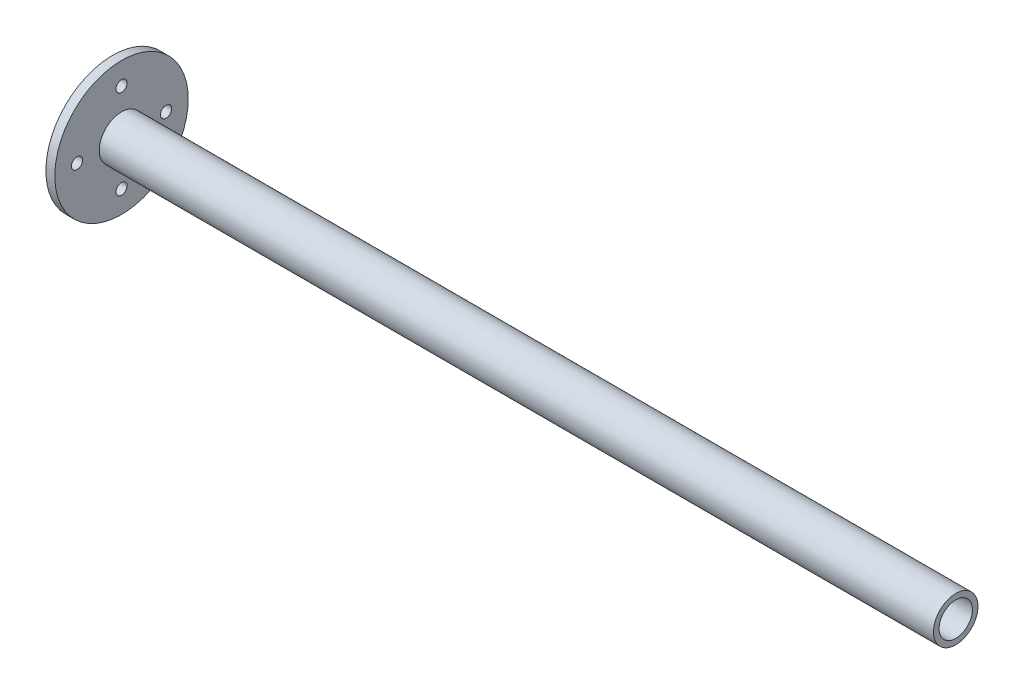
ISO-10303-21;
HEADER;
FILE_DESCRIPTION(('STEP AP214'),'2;1');
FILE_NAME('part.step','',(''),(''),'','','');
FILE_SCHEMA(('AUTOMOTIVE_DESIGN { 1 0 10303 214 1 1 1 1 }'));
ENDSEC;
DATA;
#1=APPLICATION_CONTEXT('core data for automotive mechanical design processes');
#2=APPLICATION_PROTOCOL_DEFINITION('international standard','automotive_design',2000,#1);
#3=PRODUCT_CONTEXT('',#1,'mechanical');
#4=PRODUCT('Part','Part','',(#3));
#5=PRODUCT_RELATED_PRODUCT_CATEGORY('part','',(#4));
#6=PRODUCT_DEFINITION_FORMATION('','',#4);
#7=PRODUCT_DEFINITION_CONTEXT('part definition',#1,'design');
#8=PRODUCT_DEFINITION('design','',#6,#7);
#9=PRODUCT_DEFINITION_SHAPE('','',#8);
#10=(LENGTH_UNIT() NAMED_UNIT(*) SI_UNIT(.MILLI.,.METRE.));
#11=(NAMED_UNIT(*) PLANE_ANGLE_UNIT() SI_UNIT($,.RADIAN.));
#12=(NAMED_UNIT(*) SI_UNIT($,.STERADIAN.) SOLID_ANGLE_UNIT());
#13=UNCERTAINTY_MEASURE_WITH_UNIT(LENGTH_MEASURE(1.E-05),#10,'distance_accuracy_value','');
#14=(GEOMETRIC_REPRESENTATION_CONTEXT(3) GLOBAL_UNCERTAINTY_ASSIGNED_CONTEXT((#13)) GLOBAL_UNIT_ASSIGNED_CONTEXT((#10,
#11,#12)) REPRESENTATION_CONTEXT('',''));
#15=CARTESIAN_POINT('',(0.,0.,0.));
#16=DIRECTION('',(0.,0.,1.));
#17=DIRECTION('',(1.,0.,0.));
#18=AXIS2_PLACEMENT_3D('',#15,#16,#17);
#19=CARTESIAN_POINT('',(1.6,8.,0.));
#20=DIRECTION('',(-1.,0.,0.));
#21=DIRECTION('',(0.,0.,1.));
#22=AXIS2_PLACEMENT_3D('',#19,#20,#21);
#23=CYLINDRICAL_SURFACE('',#22,1.);
#24=CARTESIAN_POINT('',(1.6,8.,0.));
#25=DIRECTION('',(1.,0.,0.));
#26=DIRECTION('',(0.,0.,-1.));
#27=AXIS2_PLACEMENT_3D('',#24,#25,#26);
#28=CIRCLE('',#27,1.);
#29=CARTESIAN_POINT('',(1.6,8.,-1.));
#30=VERTEX_POINT('',#29);
#31=EDGE_CURVE('E45',#30,#30,#28,.T.);
#32=ORIENTED_EDGE('',*,*,#31,.T.);
#33=EDGE_LOOP('',(#32));
#34=FACE_BOUND('',#33,.T.);
#35=CARTESIAN_POINT('',(0.,8.,0.));
#36=DIRECTION('',(1.,0.,0.));
#37=DIRECTION('',(0.,0.,-1.));
#38=AXIS2_PLACEMENT_3D('',#35,#36,#37);
#39=CIRCLE('',#38,1.);
#40=CARTESIAN_POINT('',(0.,8.,-1.));
#41=VERTEX_POINT('',#40);
#42=EDGE_CURVE('E67',#41,#41,#39,.T.);
#43=ORIENTED_EDGE('',*,*,#42,.F.);
#44=EDGE_LOOP('',(#43));
#45=FACE_BOUND('',#44,.T.);
#46=ADVANCED_FACE('F36',(#34,#45),#23,.F.);
#47=CARTESIAN_POINT('',(1.6,2.26393958003914E-13,-8.00000000000023));
#48=DIRECTION('',(-1.,0.,0.));
#49=DIRECTION('',(0.,0.,1.));
#50=AXIS2_PLACEMENT_3D('',#47,#48,#49);
#51=CYLINDRICAL_SURFACE('',#50,1.00000000000018);
#52=CARTESIAN_POINT('',(1.6,2.26393958003914E-13,-8.00000000000023));
#53=DIRECTION('',(1.,0.,0.));
#54=DIRECTION('',(0.,0.,-1.));
#55=AXIS2_PLACEMENT_3D('',#52,#53,#54);
#56=CIRCLE('',#55,1.00000000000018);
#57=CARTESIAN_POINT('',(1.6,2.26393958003914E-13,-9.0000000000004));
#58=VERTEX_POINT('',#57);
#59=EDGE_CURVE('E51',#58,#58,#56,.T.);
#60=ORIENTED_EDGE('',*,*,#59,.T.);
#61=EDGE_LOOP('',(#60));
#62=FACE_BOUND('',#61,.T.);
#63=CARTESIAN_POINT('',(0.,2.26393958003914E-13,-8.00000000000023));
#64=DIRECTION('',(1.,0.,0.));
#65=DIRECTION('',(0.,0.,-1.));
#66=AXIS2_PLACEMENT_3D('',#63,#64,#65);
#67=CIRCLE('',#66,1.00000000000018);
#68=CARTESIAN_POINT('',(0.,2.26393958003914E-13,-9.0000000000004));
#69=VERTEX_POINT('',#68);
#70=EDGE_CURVE('E64',#69,#69,#67,.T.);
#71=ORIENTED_EDGE('',*,*,#70,.F.);
#72=EDGE_LOOP('',(#71));
#73=FACE_BOUND('',#72,.T.);
#74=ADVANCED_FACE('F93',(#62,#73),#51,.F.);
#75=CARTESIAN_POINT('',(1.6,-8.,-4.52787916007828E-13));
#76=DIRECTION('',(-1.,0.,0.));
#77=DIRECTION('',(0.,0.,1.));
#78=AXIS2_PLACEMENT_3D('',#75,#76,#77);
#79=CYLINDRICAL_SURFACE('',#78,1.00000000000049);
#80=CARTESIAN_POINT('',(1.6,-8.,-4.52787916007828E-13));
#81=DIRECTION('',(1.,0.,0.));
#82=DIRECTION('',(0.,0.,-1.));
#83=AXIS2_PLACEMENT_3D('',#80,#81,#82);
#84=CIRCLE('',#83,1.00000000000049);
#85=CARTESIAN_POINT('',(1.6,-8.,-1.00000000000094));
#86=VERTEX_POINT('',#85);
#87=EDGE_CURVE('E79',#86,#86,#84,.T.);
#88=ORIENTED_EDGE('',*,*,#87,.T.);
#89=EDGE_LOOP('',(#88));
#90=FACE_BOUND('',#89,.T.);
#91=CARTESIAN_POINT('',(0.,-8.,-4.52787916007828E-13));
#92=DIRECTION('',(1.,0.,0.));
#93=DIRECTION('',(0.,0.,-1.));
#94=AXIS2_PLACEMENT_3D('',#91,#92,#93);
#95=CIRCLE('',#94,1.00000000000049);
#96=CARTESIAN_POINT('',(0.,-8.,-1.00000000000094));
#97=VERTEX_POINT('',#96);
#98=EDGE_CURVE('E59',#97,#97,#95,.T.);
#99=ORIENTED_EDGE('',*,*,#98,.F.);
#100=EDGE_LOOP('',(#99));
#101=FACE_BOUND('',#100,.T.);
#102=ADVANCED_FACE('F111',(#90,#101),#79,.F.);
#103=CARTESIAN_POINT('',(1.6,-2.27373675443232E-13,7.99999999999977));
#104=DIRECTION('',(-1.,0.,0.));
#105=DIRECTION('',(0.,0.,1.));
#106=AXIS2_PLACEMENT_3D('',#103,#104,#105);
#107=CYLINDRICAL_SURFACE('',#106,1.00000000000036);
#108=CARTESIAN_POINT('',(1.6,-2.27373675443232E-13,7.99999999999977));
#109=DIRECTION('',(1.,0.,0.));
#110=DIRECTION('',(0.,0.,-1.));
#111=AXIS2_PLACEMENT_3D('',#108,#109,#110);
#112=CIRCLE('',#111,1.00000000000036);
#113=CARTESIAN_POINT('',(1.6,-2.27373675443232E-13,6.99999999999941));
#114=VERTEX_POINT('',#113);
#115=EDGE_CURVE('E74',#114,#114,#112,.T.);
#116=ORIENTED_EDGE('',*,*,#115,.T.);
#117=EDGE_LOOP('',(#116));
#118=FACE_BOUND('',#117,.T.);
#119=CARTESIAN_POINT('',(0.,-2.27373675443232E-13,7.99999999999977));
#120=DIRECTION('',(1.,0.,0.));
#121=DIRECTION('',(0.,0.,-1.));
#122=AXIS2_PLACEMENT_3D('',#119,#120,#121);
#123=CIRCLE('',#122,1.00000000000036);
#124=CARTESIAN_POINT('',(0.,-2.27373675443232E-13,6.99999999999941));
#125=VERTEX_POINT('',#124);
#126=EDGE_CURVE('E55',#125,#125,#123,.T.);
#127=ORIENTED_EDGE('',*,*,#126,.F.);
#128=EDGE_LOOP('',(#127));
#129=FACE_BOUND('',#128,.T.);
#130=ADVANCED_FACE('F38',(#118,#129),#107,.F.);
#131=CARTESIAN_POINT('',(1.6,0.,0.));
#132=DIRECTION('',(-1.,0.,0.));
#133=DIRECTION('',(0.,0.,1.));
#134=AXIS2_PLACEMENT_3D('',#131,#132,#133);
#135=CYLINDRICAL_SURFACE('',#134,12.);
#136=CARTESIAN_POINT('',(1.6,0.,0.));
#137=DIRECTION('',(1.,0.,0.));
#138=DIRECTION('',(0.,0.,-1.));
#139=AXIS2_PLACEMENT_3D('',#136,#137,#138);
#140=CIRCLE('',#139,12.);
#141=CARTESIAN_POINT('',(1.6,0.,-12.));
#142=VERTEX_POINT('',#141);
#143=EDGE_CURVE('E10',#142,#142,#140,.T.);
#144=ORIENTED_EDGE('',*,*,#143,.F.);
#145=EDGE_LOOP('',(#144));
#146=FACE_BOUND('',#145,.T.);
#147=CARTESIAN_POINT('',(0.,0.,0.));
#148=DIRECTION('',(1.,0.,0.));
#149=DIRECTION('',(0.,0.,-1.));
#150=AXIS2_PLACEMENT_3D('',#147,#148,#149);
#151=CIRCLE('',#150,12.);
#152=CARTESIAN_POINT('',(0.,0.,-12.));
#153=VERTEX_POINT('',#152);
#154=EDGE_CURVE('E40',#153,#153,#151,.T.);
#155=ORIENTED_EDGE('',*,*,#154,.T.);
#156=EDGE_LOOP('',(#155));
#157=FACE_BOUND('',#156,.T.);
#158=ADVANCED_FACE('F100',(#146,#157),#135,.T.);
#159=CARTESIAN_POINT('',(1.6,0.,0.));
#160=DIRECTION('',(1.,0.,0.));
#161=DIRECTION('',(0.,0.,-1.));
#162=AXIS2_PLACEMENT_3D('',#159,#160,#161);
#163=PLANE('',#162);
#164=CARTESIAN_POINT('',(1.6,0.,0.));
#165=DIRECTION('',(1.,0.,0.));
#166=DIRECTION('',(0.,0.,-1.));
#167=AXIS2_PLACEMENT_3D('',#164,#165,#166);
#168=CIRCLE('',#167,4.);
#169=CARTESIAN_POINT('',(1.6,0.,-4.));
#170=VERTEX_POINT('',#169);
#171=EDGE_CURVE('E87',#170,#170,#168,.T.);
#172=ORIENTED_EDGE('',*,*,#171,.F.);
#173=EDGE_LOOP('',(#172));
#174=FACE_BOUND('',#173,.T.);
#175=ORIENTED_EDGE('',*,*,#115,.F.);
#176=EDGE_LOOP('',(#175));
#177=FACE_BOUND('',#176,.T.);
#178=ORIENTED_EDGE('',*,*,#87,.F.);
#179=EDGE_LOOP('',(#178));
#180=FACE_BOUND('',#179,.T.);
#181=ORIENTED_EDGE('',*,*,#59,.F.);
#182=EDGE_LOOP('',(#181));
#183=FACE_BOUND('',#182,.T.);
#184=ORIENTED_EDGE('',*,*,#31,.F.);
#185=EDGE_LOOP('',(#184));
#186=FACE_BOUND('',#185,.T.);
#187=ORIENTED_EDGE('',*,*,#143,.T.);
#188=EDGE_LOOP('',(#187));
#189=FACE_BOUND('',#188,.T.);
#190=ADVANCED_FACE('F96',(#174,#177,#180,#183,#186,#189),#163,.T.);
#191=CARTESIAN_POINT('',(0.,0.,0.));
#192=DIRECTION('',(1.,0.,0.));
#193=DIRECTION('',(0.,0.,-1.));
#194=AXIS2_PLACEMENT_3D('',#191,#192,#193);
#195=PLANE('',#194);
#196=CARTESIAN_POINT('',(0.,0.,0.));
#197=DIRECTION('',(-1.,0.,0.));
#198=DIRECTION('',(0.,0.,1.));
#199=AXIS2_PLACEMENT_3D('',#196,#197,#198);
#200=CIRCLE('',#199,3.);
#201=CARTESIAN_POINT('',(0.,0.,3.));
#202=VERTEX_POINT('',#201);
#203=EDGE_CURVE('E150',#202,#202,#200,.T.);
#204=ORIENTED_EDGE('',*,*,#203,.F.);
#205=EDGE_LOOP('',(#204));
#206=FACE_BOUND('',#205,.T.);
#207=ORIENTED_EDGE('',*,*,#126,.T.);
#208=EDGE_LOOP('',(#207));
#209=FACE_BOUND('',#208,.T.);
#210=ORIENTED_EDGE('',*,*,#98,.T.);
#211=EDGE_LOOP('',(#210));
#212=FACE_BOUND('',#211,.T.);
#213=ORIENTED_EDGE('',*,*,#70,.T.);
#214=EDGE_LOOP('',(#213));
#215=FACE_BOUND('',#214,.T.);
#216=ORIENTED_EDGE('',*,*,#42,.T.);
#217=EDGE_LOOP('',(#216));
#218=FACE_BOUND('',#217,.T.);
#219=ORIENTED_EDGE('',*,*,#154,.F.);
#220=EDGE_LOOP('',(#219));
#221=FACE_BOUND('',#220,.T.);
#222=ADVANCED_FACE('F99',(#206,#209,#212,#215,#218,#221),#195,.F.);
#223=CARTESIAN_POINT('',(151.6,0.,0.));
#224=DIRECTION('',(1.,0.,0.));
#225=DIRECTION('',(0.,0.,-1.));
#226=AXIS2_PLACEMENT_3D('',#223,#224,#225);
#227=PLANE('',#226);
#228=CARTESIAN_POINT('',(151.6,0.,0.));
#229=DIRECTION('',(1.,0.,0.));
#230=DIRECTION('',(0.,0.,-1.));
#231=AXIS2_PLACEMENT_3D('',#228,#229,#230);
#232=CIRCLE('',#231,4.);
#233=CARTESIAN_POINT('',(151.6,0.,-4.));
#234=VERTEX_POINT('',#233);
#235=EDGE_CURVE('E60',#234,#234,#232,.T.);
#236=ORIENTED_EDGE('',*,*,#235,.T.);
#237=EDGE_LOOP('',(#236));
#238=FACE_BOUND('',#237,.T.);
#239=CARTESIAN_POINT('',(151.6,0.,0.));
#240=DIRECTION('',(1.,0.,0.));
#241=DIRECTION('',(0.,0.,-1.));
#242=AXIS2_PLACEMENT_3D('',#239,#240,#241);
#243=CIRCLE('',#242,3.);
#244=CARTESIAN_POINT('',(151.6,0.,-3.));
#245=VERTEX_POINT('',#244);
#246=EDGE_CURVE('E153',#245,#245,#243,.T.);
#247=ORIENTED_EDGE('',*,*,#246,.F.);
#248=EDGE_LOOP('',(#247));
#249=FACE_BOUND('',#248,.T.);
#250=ADVANCED_FACE('F126',(#238,#249),#227,.T.);
#251=CARTESIAN_POINT('',(151.6,0.,0.));
#252=DIRECTION('',(-1.,0.,0.));
#253=DIRECTION('',(0.,0.,1.));
#254=AXIS2_PLACEMENT_3D('',#251,#252,#253);
#255=CYLINDRICAL_SURFACE('',#254,4.);
#256=ORIENTED_EDGE('',*,*,#235,.F.);
#257=EDGE_LOOP('',(#256));
#258=FACE_BOUND('',#257,.T.);
#259=ORIENTED_EDGE('',*,*,#171,.T.);
#260=EDGE_LOOP('',(#259));
#261=FACE_BOUND('',#260,.T.);
#262=ADVANCED_FACE('F135',(#258,#261),#255,.T.);
#263=CARTESIAN_POINT('',(151.6,0.,0.));
#264=DIRECTION('',(-1.,0.,0.));
#265=DIRECTION('',(0.,0.,1.));
#266=AXIS2_PLACEMENT_3D('',#263,#264,#265);
#267=CYLINDRICAL_SURFACE('',#266,3.);
#268=ORIENTED_EDGE('',*,*,#203,.T.);
#269=EDGE_LOOP('',(#268));
#270=FACE_BOUND('',#269,.T.);
#271=ORIENTED_EDGE('',*,*,#246,.T.);
#272=EDGE_LOOP('',(#271));
#273=FACE_BOUND('',#272,.T.);
#274=ADVANCED_FACE('F142',(#270,#273),#267,.F.);
#275=CLOSED_SHELL('',(#46,#74,#102,#130,#158,#190,#222,#250,#262,#274));
#276=MANIFOLD_SOLID_BREP('B2',#275);
#277=ADVANCED_BREP_SHAPE_REPRESENTATION('',(#18,#276),#14);
#278=SHAPE_DEFINITION_REPRESENTATION(#9,#277);
ENDSEC;
END-ISO-10303-21;
